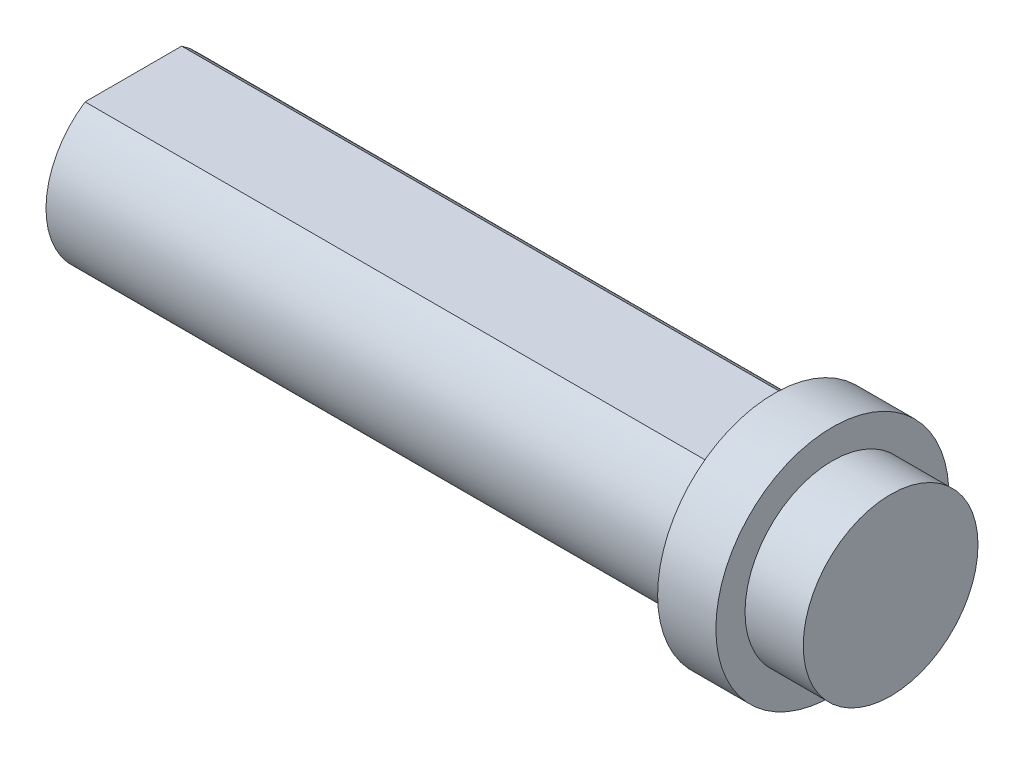
ISO-10303-21;
HEADER;
FILE_DESCRIPTION(('STEP AP214'),'2;1');
FILE_NAME('part.step','',(''),(''),'','','');
FILE_SCHEMA(('AUTOMOTIVE_DESIGN { 1 0 10303 214 1 1 1 1 }'));
ENDSEC;
DATA;
#1=APPLICATION_CONTEXT('core data for automotive mechanical design processes');
#2=APPLICATION_PROTOCOL_DEFINITION('international standard','automotive_design',2000,#1);
#3=PRODUCT_CONTEXT('',#1,'mechanical');
#4=PRODUCT('Part','Part','',(#3));
#5=PRODUCT_RELATED_PRODUCT_CATEGORY('part','',(#4));
#6=PRODUCT_DEFINITION_FORMATION('','',#4);
#7=PRODUCT_DEFINITION_CONTEXT('part definition',#1,'design');
#8=PRODUCT_DEFINITION('design','',#6,#7);
#9=PRODUCT_DEFINITION_SHAPE('','',#8);
#10=(LENGTH_UNIT() NAMED_UNIT(*) SI_UNIT(.MILLI.,.METRE.));
#11=(NAMED_UNIT(*) PLANE_ANGLE_UNIT() SI_UNIT($,.RADIAN.));
#12=(NAMED_UNIT(*) SI_UNIT($,.STERADIAN.) SOLID_ANGLE_UNIT());
#13=UNCERTAINTY_MEASURE_WITH_UNIT(LENGTH_MEASURE(1.E-05),#10,'distance_accuracy_value','');
#14=(GEOMETRIC_REPRESENTATION_CONTEXT(3) GLOBAL_UNCERTAINTY_ASSIGNED_CONTEXT((#13)) GLOBAL_UNIT_ASSIGNED_CONTEXT((#10,
#11,#12)) REPRESENTATION_CONTEXT('',''));
#15=CARTESIAN_POINT('',(0.,0.,0.));
#16=DIRECTION('',(0.,0.,1.));
#17=DIRECTION('',(1.,0.,0.));
#18=AXIS2_PLACEMENT_3D('',#15,#16,#17);
#19=CARTESIAN_POINT('',(22.,2.5,-1.6583123951777));
#20=DIRECTION('',(0.,-1.,0.));
#21=DIRECTION('',(0.,0.,-1.));
#22=AXIS2_PLACEMENT_3D('',#19,#20,#21);
#23=PLANE('',#22);
#24=DIRECTION('',(0.,0.,-1.));
#25=VECTOR('',#24,1.);
#26=CARTESIAN_POINT('',(21.5,2.5,1.66));
#27=LINE('',#26,#25);
#28=CARTESIAN_POINT('',(21.5,2.5,1.6583123951777));
#29=VERTEX_POINT('',#28);
#30=CARTESIAN_POINT('',(21.5,2.5,-1.6583123951777));
#31=VERTEX_POINT('',#30);
#32=EDGE_CURVE('E129',#29,#31,#27,.T.);
#33=ORIENTED_EDGE('',*,*,#32,.T.);
#34=DIRECTION('',(-1.,0.,0.));
#35=VECTOR('',#34,1.);
#36=CARTESIAN_POINT('',(22.,2.5,-1.6583123951777));
#37=LINE('',#36,#35);
#38=CARTESIAN_POINT('',(0.,2.5,-1.6583123951777));
#39=VERTEX_POINT('',#38);
#40=EDGE_CURVE('E60',#31,#39,#37,.T.);
#41=ORIENTED_EDGE('',*,*,#40,.T.);
#42=DIRECTION('',(0.,0.,1.));
#43=VECTOR('',#42,1.);
#44=CARTESIAN_POINT('',(0.,2.5,-1.6583123951777));
#45=LINE('',#44,#43);
#46=CARTESIAN_POINT('',(0.,2.5,1.6583123951777));
#47=VERTEX_POINT('',#46);
#48=EDGE_CURVE('E136',#39,#47,#45,.T.);
#49=ORIENTED_EDGE('',*,*,#48,.T.);
#50=DIRECTION('',(-1.,0.,0.));
#51=VECTOR('',#50,1.);
#52=CARTESIAN_POINT('',(22.,2.5,1.6583123951777));
#53=LINE('',#52,#51);
#54=EDGE_CURVE('E142',#29,#47,#53,.T.);
#55=ORIENTED_EDGE('',*,*,#54,.F.);
#56=EDGE_LOOP('',(#33,#41,#49,#55));
#57=FACE_BOUND('',#56,.T.);
#58=ADVANCED_FACE('F37',(#57),#23,.F.);
#59=CARTESIAN_POINT('',(22.,0.,0.));
#60=DIRECTION('',(-1.,0.,0.));
#61=DIRECTION('',(0.,0.,1.));
#62=AXIS2_PLACEMENT_3D('',#59,#60,#61);
#63=PLANE('',#62);
#64=CARTESIAN_POINT('',(22.,0.,0.));
#65=DIRECTION('',(-1.,0.,0.));
#66=DIRECTION('',(0.,0.,1.));
#67=AXIS2_PLACEMENT_3D('',#64,#65,#66);
#68=CIRCLE('',#67,4.);
#69=CARTESIAN_POINT('',(22.,0.,4.));
#70=VERTEX_POINT('',#69);
#71=EDGE_CURVE('E132',#70,#70,#68,.T.);
#72=ORIENTED_EDGE('',*,*,#71,.T.);
#73=EDGE_LOOP('',(#72));
#74=FACE_BOUND('',#73,.T.);
#75=DIRECTION('',(0.,1.,0.));
#76=VECTOR('',#75,1.);
#77=CARTESIAN_POINT('',(22.,2.75,1.66));
#78=LINE('',#77,#76);
#79=CARTESIAN_POINT('',(22.,2.5,1.66));
#80=VERTEX_POINT('',#79);
#81=CARTESIAN_POINT('',(22.,2.75,1.66));
#82=VERTEX_POINT('',#81);
#83=EDGE_CURVE('E96',#80,#82,#78,.T.);
#84=ORIENTED_EDGE('',*,*,#83,.F.);
#85=DIRECTION('',(0.,0.,-1.));
#86=VECTOR('',#85,1.);
#87=CARTESIAN_POINT('',(22.,2.5,1.66));
#88=LINE('',#87,#86);
#89=CARTESIAN_POINT('',(22.,2.5,1.6583123951777));
#90=VERTEX_POINT('',#89);
#91=EDGE_CURVE('E104',#80,#90,#88,.T.);
#92=ORIENTED_EDGE('',*,*,#91,.T.);
#93=CARTESIAN_POINT('',(22.,0.,0.));
#94=DIRECTION('',(-1.,0.,0.));
#95=DIRECTION('',(0.,0.,1.));
#96=AXIS2_PLACEMENT_3D('',#93,#94,#95);
#97=CIRCLE('',#96,3.);
#98=CARTESIAN_POINT('',(22.,2.5,-1.6583123951777));
#99=VERTEX_POINT('',#98);
#100=EDGE_CURVE('E111',#99,#90,#97,.T.);
#101=ORIENTED_EDGE('',*,*,#100,.F.);
#102=DIRECTION('',(0.,0.,-1.));
#103=VECTOR('',#102,1.);
#104=CARTESIAN_POINT('',(22.,2.5,0.));
#105=LINE('',#104,#103);
#106=CARTESIAN_POINT('',(22.,2.5,-1.66));
#107=VERTEX_POINT('',#106);
#108=EDGE_CURVE('E11',#99,#107,#105,.T.);
#109=ORIENTED_EDGE('',*,*,#108,.T.);
#110=DIRECTION('',(0.,1.,0.));
#111=VECTOR('',#110,1.);
#112=CARTESIAN_POINT('',(22.,2.75,-1.66));
#113=LINE('',#112,#111);
#114=CARTESIAN_POINT('',(22.,2.75,-1.66));
#115=VERTEX_POINT('',#114);
#116=EDGE_CURVE('E124',#107,#115,#113,.T.);
#117=ORIENTED_EDGE('',*,*,#116,.T.);
#118=DIRECTION('',(0.,0.,-1.));
#119=VECTOR('',#118,1.);
#120=CARTESIAN_POINT('',(22.,2.75,1.66));
#121=LINE('',#120,#119);
#122=EDGE_CURVE('E112',#82,#115,#121,.T.);
#123=ORIENTED_EDGE('',*,*,#122,.F.);
#124=EDGE_LOOP('',(#84,#92,#101,#109,#117,#123));
#125=FACE_BOUND('',#124,.T.);
#126=ADVANCED_FACE('F115',(#74,#125),#63,.T.);
#127=CARTESIAN_POINT('',(26.,0.,0.));
#128=DIRECTION('',(-1.,0.,0.));
#129=DIRECTION('',(0.,0.,1.));
#130=AXIS2_PLACEMENT_3D('',#127,#128,#129);
#131=CYLINDRICAL_SURFACE('',#130,3.);
#132=CARTESIAN_POINT('',(26.,0.,0.));
#133=DIRECTION('',(1.,0.,0.));
#134=DIRECTION('',(0.,0.,-1.));
#135=AXIS2_PLACEMENT_3D('',#132,#133,#134);
#136=CIRCLE('',#135,3.);
#137=CARTESIAN_POINT('',(26.,0.,3.));
#138=VERTEX_POINT('',#137);
#139=EDGE_CURVE('E145',#138,#138,#136,.T.);
#140=CARTESIAN_POINT('',(24.,0.,0.));
#141=DIRECTION('',(-1.,0.,0.));
#142=DIRECTION('',(0.,0.,1.));
#143=AXIS2_PLACEMENT_3D('',#140,#141,#142);
#144=CIRCLE('',#143,3.);
#145=CARTESIAN_POINT('',(24.,0.,3.));
#146=VERTEX_POINT('',#145);
#147=EDGE_CURVE('E45',#146,#146,#144,.T.);
#148=CARTESIAN_POINT('',(26.,0.,3.));
#149=CARTESIAN_POINT('',(25.9791666666667,0.,3.));
#150=CARTESIAN_POINT('',(25.9583333333333,0.,3.));
#151=CARTESIAN_POINT('',(25.9166666666667,0.,3.));
#152=CARTESIAN_POINT('',(25.8958333333333,0.,3.));
#153=CARTESIAN_POINT('',(25.8541666666667,0.,3.));
#154=CARTESIAN_POINT('',(25.8333333333333,0.,3.));
#155=CARTESIAN_POINT('',(25.7916666666667,0.,3.));
#156=CARTESIAN_POINT('',(25.7708333333333,0.,3.));
#157=CARTESIAN_POINT('',(25.7291666666667,0.,3.));
#158=CARTESIAN_POINT('',(25.7083333333333,0.,3.));
#159=CARTESIAN_POINT('',(25.6666666666667,0.,3.));
#160=CARTESIAN_POINT('',(25.6458333333333,0.,3.));
#161=CARTESIAN_POINT('',(25.6041666666667,0.,3.));
#162=CARTESIAN_POINT('',(25.5833333333333,0.,3.));
#163=CARTESIAN_POINT('',(25.5416666666667,0.,3.));
#164=CARTESIAN_POINT('',(25.5208333333333,0.,3.));
#165=CARTESIAN_POINT('',(25.4791666666667,0.,3.));
#166=CARTESIAN_POINT('',(25.4583333333333,0.,3.));
#167=CARTESIAN_POINT('',(25.4166666666667,0.,3.));
#168=CARTESIAN_POINT('',(25.3958333333333,0.,3.));
#169=CARTESIAN_POINT('',(25.3541666666667,0.,3.));
#170=CARTESIAN_POINT('',(25.3333333333333,0.,3.));
#171=CARTESIAN_POINT('',(25.2916666666667,0.,3.));
#172=CARTESIAN_POINT('',(25.2708333333333,0.,3.));
#173=CARTESIAN_POINT('',(25.2291666666667,0.,3.));
#174=CARTESIAN_POINT('',(25.2083333333333,0.,3.));
#175=CARTESIAN_POINT('',(25.1666666666667,0.,3.));
#176=CARTESIAN_POINT('',(25.1458333333333,0.,3.));
#177=CARTESIAN_POINT('',(25.1041666666667,0.,3.));
#178=CARTESIAN_POINT('',(25.0833333333333,0.,3.));
#179=CARTESIAN_POINT('',(25.0416666666667,0.,3.));
#180=CARTESIAN_POINT('',(25.0208333333333,0.,3.));
#181=CARTESIAN_POINT('',(24.9791666666667,0.,3.));
#182=CARTESIAN_POINT('',(24.9583333333333,0.,3.));
#183=CARTESIAN_POINT('',(24.9166666666667,0.,3.));
#184=CARTESIAN_POINT('',(24.8958333333333,0.,3.));
#185=CARTESIAN_POINT('',(24.8541666666667,0.,3.));
#186=CARTESIAN_POINT('',(24.8333333333333,0.,3.));
#187=CARTESIAN_POINT('',(24.7916666666667,0.,3.));
#188=CARTESIAN_POINT('',(24.7708333333333,0.,3.));
#189=CARTESIAN_POINT('',(24.7291666666667,0.,3.));
#190=CARTESIAN_POINT('',(24.7083333333333,0.,3.));
#191=CARTESIAN_POINT('',(24.6666666666667,0.,3.));
#192=CARTESIAN_POINT('',(24.6458333333333,0.,3.));
#193=CARTESIAN_POINT('',(24.6041666666667,0.,3.));
#194=CARTESIAN_POINT('',(24.5833333333333,0.,3.));
#195=CARTESIAN_POINT('',(24.5416666666667,0.,3.));
#196=CARTESIAN_POINT('',(24.5208333333333,0.,3.));
#197=CARTESIAN_POINT('',(24.4791666666667,0.,3.));
#198=CARTESIAN_POINT('',(24.4583333333333,0.,3.));
#199=CARTESIAN_POINT('',(24.4166666666667,0.,3.));
#200=CARTESIAN_POINT('',(24.3958333333333,0.,3.));
#201=CARTESIAN_POINT('',(24.3541666666667,0.,3.));
#202=CARTESIAN_POINT('',(24.3333333333333,0.,3.));
#203=CARTESIAN_POINT('',(24.2916666666667,0.,3.));
#204=CARTESIAN_POINT('',(24.2708333333333,0.,3.));
#205=CARTESIAN_POINT('',(24.2291666666667,0.,3.));
#206=CARTESIAN_POINT('',(24.2083333333333,0.,3.));
#207=CARTESIAN_POINT('',(24.1666666666667,0.,3.));
#208=CARTESIAN_POINT('',(24.1458333333333,0.,3.));
#209=CARTESIAN_POINT('',(24.1041666666667,0.,3.));
#210=CARTESIAN_POINT('',(24.0833333333333,0.,3.));
#211=CARTESIAN_POINT('',(24.0416666666667,0.,3.));
#212=CARTESIAN_POINT('',(24.0208333333333,0.,3.));
#213=CARTESIAN_POINT('',(24.,0.,3.));
#214=B_SPLINE_CURVE_WITH_KNOTS('',3,(#148,#149,#150,#151,#152,#153,#154,#155,#156,#157,#158,
#159,#160,#161,#162,#163,#164,#165,#166,#167,#168,#169,#170,#171,#172,#173,#174,#175,#176,#177,
#178,#179,#180,#181,#182,#183,#184,#185,#186,#187,#188,#189,#190,#191,#192,#193,#194,#195,#196,
#197,#198,#199,#200,#201,#202,#203,#204,#205,#206,#207,#208,#209,#210,#211,#212,#213),
.UNSPECIFIED.,.F.,.F.,(4,2,2,2,2,2,2,2,2,2,2,2,2,2,2,2,2,2,2,2,2,2,2,2,2,2,2,2,2,2,2,2,4),(0.,
0.0624999999999966,0.124999999999997,0.187499999999997,0.249999999999997,0.312499999999997,
0.374999999999997,0.437499999999997,0.499999999999997,0.562499999999997,0.624999999999997,
0.687499999999997,0.749999999999997,0.812499999999997,0.874999999999997,0.937499999999997,
0.999999999999994,1.06249999999999,1.12499999999999,1.18749999999999,1.24999999999999,
1.31249999999999,1.37499999999999,1.43749999999999,1.49999999999999,1.56249999999999,
1.62499999999999,1.68749999999999,1.74999999999999,1.81249999999999,1.87499999999999,
1.93749999999999,1.99999999999999),.UNSPECIFIED.);
#215=EDGE_CURVE('BSEAM155',#138,#146,#214,.T.);
#216=ORIENTED_EDGE('',*,*,#139,.F.);
#217=ORIENTED_EDGE('',*,*,#147,.F.);
#218=ORIENTED_EDGE('',*,*,#215,.T.);
#219=ORIENTED_EDGE('',*,*,#215,.F.);
#220=EDGE_LOOP('',(#216,#218,#217,#219));
#221=FACE_BOUND('',#220,.T.);
#222=ADVANCED_FACE('F155',(#221),#131,.T.);
#223=CARTESIAN_POINT('',(26.,0.,0.));
#224=DIRECTION('',(1.,0.,0.));
#225=DIRECTION('',(0.,0.,-1.));
#226=AXIS2_PLACEMENT_3D('',#223,#224,#225);
#227=PLANE('',#226);
#228=ORIENTED_EDGE('',*,*,#139,.T.);
#229=EDGE_LOOP('',(#228));
#230=FACE_BOUND('',#229,.T.);
#231=ADVANCED_FACE('F157',(#230),#227,.T.);
#232=CARTESIAN_POINT('',(24.,0.,0.));
#233=DIRECTION('',(-1.,0.,0.));
#234=DIRECTION('',(0.,0.,1.));
#235=AXIS2_PLACEMENT_3D('',#232,#233,#234);
#236=CYLINDRICAL_SURFACE('',#235,4.);
#237=CARTESIAN_POINT('',(24.,0.,0.));
#238=DIRECTION('',(-1.,0.,0.));
#239=DIRECTION('',(0.,0.,1.));
#240=AXIS2_PLACEMENT_3D('',#237,#238,#239);
#241=CIRCLE('',#240,4.);
#242=CARTESIAN_POINT('',(24.,0.,4.));
#243=VERTEX_POINT('',#242);
#244=EDGE_CURVE('E133',#243,#243,#241,.T.);
#245=ORIENTED_EDGE('',*,*,#244,.T.);
#246=EDGE_LOOP('',(#245));
#247=FACE_BOUND('',#246,.T.);
#248=ORIENTED_EDGE('',*,*,#71,.F.);
#249=EDGE_LOOP('',(#248));
#250=FACE_BOUND('',#249,.T.);
#251=ADVANCED_FACE('F163',(#247,#250),#236,.T.);
#252=CARTESIAN_POINT('',(24.,0.,0.));
#253=DIRECTION('',(-1.,0.,0.));
#254=DIRECTION('',(0.,0.,1.));
#255=AXIS2_PLACEMENT_3D('',#252,#253,#254);
#256=PLANE('',#255);
#257=ORIENTED_EDGE('',*,*,#147,.T.);
#258=EDGE_LOOP('',(#257));
#259=FACE_BOUND('',#258,.T.);
#260=ORIENTED_EDGE('',*,*,#244,.F.);
#261=EDGE_LOOP('',(#260));
#262=FACE_BOUND('',#261,.T.);
#263=ADVANCED_FACE('F152',(#259,#262),#256,.F.);
#264=CARTESIAN_POINT('',(0.,0.,0.));
#265=DIRECTION('',(1.,0.,0.));
#266=DIRECTION('',(0.,0.,-1.));
#267=AXIS2_PLACEMENT_3D('',#264,#265,#266);
#268=PLANE('',#267);
#269=CARTESIAN_POINT('',(0.,0.,0.));
#270=DIRECTION('',(1.,0.,0.));
#271=DIRECTION('',(0.,0.,-1.));
#272=AXIS2_PLACEMENT_3D('',#269,#270,#271);
#273=CIRCLE('',#272,3.);
#274=EDGE_CURVE('E141',#47,#39,#273,.T.);
#275=ORIENTED_EDGE('',*,*,#274,.F.);
#276=ORIENTED_EDGE('',*,*,#48,.F.);
#277=EDGE_LOOP('',(#275,#276));
#278=FACE_BOUND('',#277,.T.);
#279=ADVANCED_FACE('F171',(#278),#268,.F.);
#280=EDGE_CURVE('E143',#99,#31,#37,.T.);
#281=ORIENTED_EDGE('',*,*,#280,.F.);
#282=ORIENTED_EDGE('',*,*,#100,.T.);
#283=EDGE_CURVE('E107',#90,#29,#53,.T.);
#284=ORIENTED_EDGE('',*,*,#283,.T.);
#285=ORIENTED_EDGE('',*,*,#54,.T.);
#286=ORIENTED_EDGE('',*,*,#274,.T.);
#287=ORIENTED_EDGE('',*,*,#40,.F.);
#288=EDGE_LOOP('',(#281,#282,#284,#285,#286,#287));
#289=FACE_BOUND('',#288,.T.);
#290=ADVANCED_FACE('F39',(#289),#131,.T.);
#291=CARTESIAN_POINT('',(22.,2.5,1.66));
#292=DIRECTION('',(0.,1.,0.));
#293=DIRECTION('',(0.,0.,1.));
#294=AXIS2_PLACEMENT_3D('',#291,#292,#293);
#295=PLANE('',#294);
#296=ORIENTED_EDGE('',*,*,#108,.F.);
#297=ORIENTED_EDGE('',*,*,#280,.T.);
#298=CARTESIAN_POINT('',(21.5,2.5,-1.66));
#299=VERTEX_POINT('',#298);
#300=EDGE_CURVE('E118',#31,#299,#27,.T.);
#301=ORIENTED_EDGE('',*,*,#300,.T.);
#302=DIRECTION('',(1.,0.,0.));
#303=VECTOR('',#302,1.);
#304=CARTESIAN_POINT('',(22.,2.5,-1.66));
#305=LINE('',#304,#303);
#306=EDGE_CURVE('E121',#299,#107,#305,.T.);
#307=ORIENTED_EDGE('',*,*,#306,.T.);
#308=EDGE_LOOP('',(#296,#297,#301,#307));
#309=FACE_BOUND('',#308,.T.);
#310=ADVANCED_FACE('F170',(#309),#295,.F.);
#311=CARTESIAN_POINT('',(21.5,2.5,1.66));
#312=VERTEX_POINT('',#311);
#313=EDGE_CURVE('E127',#312,#29,#27,.T.);
#314=ORIENTED_EDGE('',*,*,#313,.T.);
#315=ORIENTED_EDGE('',*,*,#283,.F.);
#316=ORIENTED_EDGE('',*,*,#91,.F.);
#317=DIRECTION('',(1.,0.,0.));
#318=VECTOR('',#317,1.);
#319=CARTESIAN_POINT('',(22.,2.5,1.66));
#320=LINE('',#319,#318);
#321=EDGE_CURVE('E92',#312,#80,#320,.T.);
#322=ORIENTED_EDGE('',*,*,#321,.F.);
#323=EDGE_LOOP('',(#314,#315,#316,#322));
#324=FACE_BOUND('',#323,.T.);
#325=ADVANCED_FACE('F105',(#324),#295,.F.);
#326=CARTESIAN_POINT('',(21.5,2.5,1.66));
#327=DIRECTION('',(0.447213595499957,-0.894427190999916,0.));
#328=DIRECTION('',(0.894427190999916,0.447213595499957,0.));
#329=AXIS2_PLACEMENT_3D('',#326,#327,#328);
#330=PLANE('',#329);
#331=DIRECTION('',(-0.894427190999916,-0.447213595499957,0.));
#332=VECTOR('',#331,1.);
#333=CARTESIAN_POINT('',(21.5,2.5,-1.66));
#334=LINE('',#333,#332);
#335=EDGE_CURVE('E52',#115,#299,#334,.T.);
#336=ORIENTED_EDGE('',*,*,#335,.T.);
#337=ORIENTED_EDGE('',*,*,#300,.F.);
#338=ORIENTED_EDGE('',*,*,#32,.F.);
#339=ORIENTED_EDGE('',*,*,#313,.F.);
#340=DIRECTION('',(-0.894427190999916,-0.447213595499957,0.));
#341=VECTOR('',#340,1.);
#342=CARTESIAN_POINT('',(21.5,2.5,1.66));
#343=LINE('',#342,#341);
#344=EDGE_CURVE('E98',#82,#312,#343,.T.);
#345=ORIENTED_EDGE('',*,*,#344,.F.);
#346=ORIENTED_EDGE('',*,*,#122,.T.);
#347=EDGE_LOOP('',(#336,#337,#338,#339,#345,#346));
#348=FACE_BOUND('',#347,.T.);
#349=ADVANCED_FACE('F190',(#348),#330,.F.);
#350=CARTESIAN_POINT('',(0.,0.,1.66));
#351=DIRECTION('',(0.,0.,1.));
#352=DIRECTION('',(1.,0.,0.));
#353=AXIS2_PLACEMENT_3D('',#350,#351,#352);
#354=PLANE('',#353);
#355=ORIENTED_EDGE('',*,*,#321,.T.);
#356=ORIENTED_EDGE('',*,*,#83,.T.);
#357=ORIENTED_EDGE('',*,*,#344,.T.);
#358=EDGE_LOOP('',(#355,#356,#357));
#359=FACE_BOUND('',#358,.T.);
#360=ADVANCED_FACE('F94',(#359),#354,.T.);
#361=CARTESIAN_POINT('',(0.,0.,-1.66));
#362=DIRECTION('',(0.,0.,1.));
#363=DIRECTION('',(1.,0.,0.));
#364=AXIS2_PLACEMENT_3D('',#361,#362,#363);
#365=PLANE('',#364);
#366=ORIENTED_EDGE('',*,*,#306,.F.);
#367=ORIENTED_EDGE('',*,*,#335,.F.);
#368=ORIENTED_EDGE('',*,*,#116,.F.);
#369=EDGE_LOOP('',(#366,#367,#368));
#370=FACE_BOUND('',#369,.T.);
#371=ADVANCED_FACE('F191',(#370),#365,.F.);
#372=CLOSED_SHELL('',(#58,#126,#222,#231,#251,#263,#279,#290,#310,#325,#349,#360,#371));
#373=MANIFOLD_SOLID_BREP('B2',#372);
#374=ADVANCED_BREP_SHAPE_REPRESENTATION('',(#18,#373),#14);
#375=SHAPE_DEFINITION_REPRESENTATION(#9,#374);
ENDSEC;
END-ISO-10303-21;
